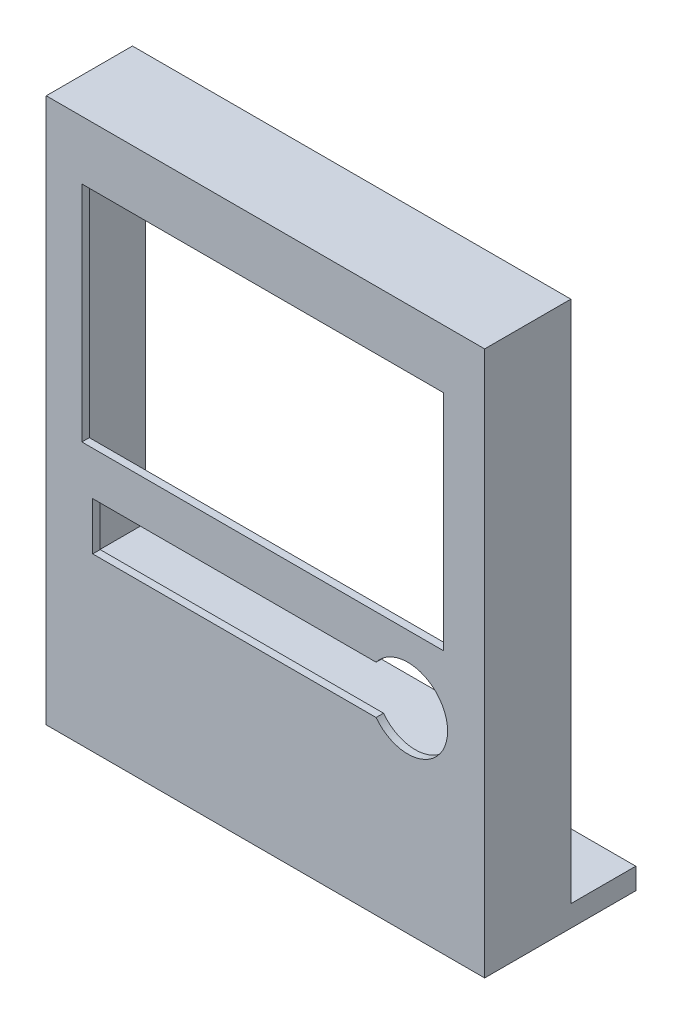
ISO-10303-21;
HEADER;
FILE_DESCRIPTION(('STEP AP214'),'2;1');
FILE_NAME('part.step','',(''),(''),'','','');
FILE_SCHEMA(('AUTOMOTIVE_DESIGN { 1 0 10303 214 1 1 1 1 }'));
ENDSEC;
DATA;
#1=APPLICATION_CONTEXT('core data for automotive mechanical design processes');
#2=APPLICATION_PROTOCOL_DEFINITION('international standard','automotive_design',2000,#1);
#3=PRODUCT_CONTEXT('',#1,'mechanical');
#4=PRODUCT('Part','Part','',(#3));
#5=PRODUCT_RELATED_PRODUCT_CATEGORY('part','',(#4));
#6=PRODUCT_DEFINITION_FORMATION('','',#4);
#7=PRODUCT_DEFINITION_CONTEXT('part definition',#1,'design');
#8=PRODUCT_DEFINITION('design','',#6,#7);
#9=PRODUCT_DEFINITION_SHAPE('','',#8);
#10=(LENGTH_UNIT() NAMED_UNIT(*) SI_UNIT(.MILLI.,.METRE.));
#11=(NAMED_UNIT(*) PLANE_ANGLE_UNIT() SI_UNIT($,.RADIAN.));
#12=(NAMED_UNIT(*) SI_UNIT($,.STERADIAN.) SOLID_ANGLE_UNIT());
#13=UNCERTAINTY_MEASURE_WITH_UNIT(LENGTH_MEASURE(1.E-05),#10,'distance_accuracy_value','');
#14=(GEOMETRIC_REPRESENTATION_CONTEXT(3) GLOBAL_UNCERTAINTY_ASSIGNED_CONTEXT((#13)) GLOBAL_UNIT_ASSIGNED_CONTEXT((#10,
#11,#12)) REPRESENTATION_CONTEXT('',''));
#15=CARTESIAN_POINT('',(0.,0.,0.));
#16=DIRECTION('',(0.,0.,1.));
#17=DIRECTION('',(1.,0.,0.));
#18=AXIS2_PLACEMENT_3D('',#15,#16,#17);
#19=CARTESIAN_POINT('',(-52.324,65.024,15.494));
#20=DIRECTION('',(0.,0.,1.));
#21=DIRECTION('',(0.,-1.,0.));
#22=AXIS2_PLACEMENT_3D('',#19,#20,#21);
#23=PLANE('',#22);
#24=DIRECTION('',(0.,-1.,0.));
#25=VECTOR('',#24,1.);
#26=CARTESIAN_POINT('',(52.324,65.024,15.494));
#27=LINE('',#26,#25);
#28=CARTESIAN_POINT('',(52.324,65.024,15.494));
#29=VERTEX_POINT('',#28);
#30=CARTESIAN_POINT('',(52.324,-59.944,15.494));
#31=VERTEX_POINT('',#30);
#32=EDGE_CURVE('E275',#29,#31,#27,.T.);
#33=ORIENTED_EDGE('',*,*,#32,.T.);
#34=DIRECTION('',(1.,0.,0.));
#35=VECTOR('',#34,1.);
#36=CARTESIAN_POINT('',(-52.324,-59.944,15.494));
#37=LINE('',#36,#35);
#38=CARTESIAN_POINT('',(-52.324,-59.944,15.494));
#39=VERTEX_POINT('',#38);
#40=EDGE_CURVE('E292',#39,#31,#37,.T.);
#41=ORIENTED_EDGE('',*,*,#40,.F.);
#42=DIRECTION('',(0.,-1.,0.));
#43=VECTOR('',#42,1.);
#44=CARTESIAN_POINT('',(-52.324,65.024,15.494));
#45=LINE('',#44,#43);
#46=CARTESIAN_POINT('',(-52.324,65.024,15.494));
#47=VERTEX_POINT('',#46);
#48=EDGE_CURVE('E274',#47,#39,#45,.T.);
#49=ORIENTED_EDGE('',*,*,#48,.F.);
#50=DIRECTION('',(1.,0.,0.));
#51=VECTOR('',#50,1.);
#52=CARTESIAN_POINT('',(-52.324,65.024,15.494));
#53=LINE('',#52,#51);
#54=EDGE_CURVE('E289',#47,#29,#53,.T.);
#55=ORIENTED_EDGE('',*,*,#54,.T.);
#56=EDGE_LOOP('',(#33,#41,#49,#55));
#57=FACE_BOUND('',#56,.T.);
#58=DIRECTION('',(0.,1.,0.));
#59=VECTOR('',#58,1.);
#60=CARTESIAN_POINT('',(49.149,0.,15.494));
#61=LINE('',#60,#59);
#62=CARTESIAN_POINT('',(49.149,-32.004,15.494));
#63=VERTEX_POINT('',#62);
#64=CARTESIAN_POINT('',(49.149,61.849,15.494));
#65=VERTEX_POINT('',#64);
#66=EDGE_CURVE('E218',#63,#65,#61,.T.);
#67=ORIENTED_EDGE('',*,*,#66,.T.);
#68=DIRECTION('',(1.,0.,0.));
#69=VECTOR('',#68,1.);
#70=CARTESIAN_POINT('',(0.,61.849,15.494));
#71=LINE('',#70,#69);
#72=CARTESIAN_POINT('',(-49.149,61.849,15.494));
#73=VERTEX_POINT('',#72);
#74=EDGE_CURVE('E232',#73,#65,#71,.T.);
#75=ORIENTED_EDGE('',*,*,#74,.F.);
#76=DIRECTION('',(0.,1.,0.));
#77=VECTOR('',#76,1.);
#78=CARTESIAN_POINT('',(-49.149,0.,15.494));
#79=LINE('',#78,#77);
#80=CARTESIAN_POINT('',(-49.149,-32.004,15.494));
#81=VERTEX_POINT('',#80);
#82=EDGE_CURVE('E251',#81,#73,#79,.T.);
#83=ORIENTED_EDGE('',*,*,#82,.F.);
#84=DIRECTION('',(1.,0.,0.));
#85=VECTOR('',#84,1.);
#86=CARTESIAN_POINT('',(0.,-32.004,15.494));
#87=LINE('',#86,#85);
#88=EDGE_CURVE('E247',#81,#63,#87,.T.);
#89=ORIENTED_EDGE('',*,*,#88,.T.);
#90=EDGE_LOOP('',(#67,#75,#83,#89));
#91=FACE_BOUND('',#90,.T.);
#92=ADVANCED_FACE('F39',(#57,#91),#23,.F.);
#93=CARTESIAN_POINT('',(52.324,-65.024,36.068));
#94=DIRECTION('',(-1.,0.,0.));
#95=DIRECTION('',(0.,0.,1.));
#96=AXIS2_PLACEMENT_3D('',#93,#94,#95);
#97=PLANE('',#96);
#98=DIRECTION('',(0.,0.,1.));
#99=VECTOR('',#98,1.);
#100=CARTESIAN_POINT('',(52.324,-59.944,0.));
#101=LINE('',#100,#99);
#102=CARTESIAN_POINT('',(52.324,-59.944,0.));
#103=VERTEX_POINT('',#102);
#104=EDGE_CURVE('E261',#103,#31,#101,.T.);
#105=ORIENTED_EDGE('',*,*,#104,.T.);
#106=ORIENTED_EDGE('',*,*,#32,.F.);
#107=DIRECTION('',(0.,0.,-1.));
#108=VECTOR('',#107,1.);
#109=CARTESIAN_POINT('',(52.324,65.024,36.068));
#110=LINE('',#109,#108);
#111=CARTESIAN_POINT('',(52.324,65.024,36.068));
#112=VERTEX_POINT('',#111);
#113=EDGE_CURVE('E330',#112,#29,#110,.T.);
#114=ORIENTED_EDGE('',*,*,#113,.F.);
#115=DIRECTION('',(0.,1.,0.));
#116=VECTOR('',#115,1.);
#117=CARTESIAN_POINT('',(52.324,-65.024,36.068));
#118=LINE('',#117,#116);
#119=CARTESIAN_POINT('',(52.324,-65.024,36.068));
#120=VERTEX_POINT('',#119);
#121=EDGE_CURVE('E296',#120,#112,#118,.T.);
#122=ORIENTED_EDGE('',*,*,#121,.F.);
#123=DIRECTION('',(0.,0.,-1.));
#124=VECTOR('',#123,1.);
#125=CARTESIAN_POINT('',(52.324,-65.024,36.068));
#126=LINE('',#125,#124);
#127=CARTESIAN_POINT('',(52.324,-65.024,0.));
#128=VERTEX_POINT('',#127);
#129=EDGE_CURVE('E310',#120,#128,#126,.T.);
#130=ORIENTED_EDGE('',*,*,#129,.T.);
#131=DIRECTION('',(0.,1.,0.));
#132=VECTOR('',#131,1.);
#133=CARTESIAN_POINT('',(52.324,-65.024,0.));
#134=LINE('',#133,#132);
#135=EDGE_CURVE('E295',#128,#103,#134,.T.);
#136=ORIENTED_EDGE('',*,*,#135,.T.);
#137=EDGE_LOOP('',(#105,#106,#114,#122,#130,#136));
#138=FACE_BOUND('',#137,.T.);
#139=ADVANCED_FACE('F41',(#138),#97,.F.);
#140=CARTESIAN_POINT('',(-52.324,-65.024,36.068));
#141=DIRECTION('',(1.,0.,0.));
#142=DIRECTION('',(0.,0.,-1.));
#143=AXIS2_PLACEMENT_3D('',#140,#141,#142);
#144=PLANE('',#143);
#145=DIRECTION('',(0.,0.,1.));
#146=VECTOR('',#145,1.);
#147=CARTESIAN_POINT('',(-52.324,-59.944,0.));
#148=LINE('',#147,#146);
#149=CARTESIAN_POINT('',(-52.324,-59.944,0.));
#150=VERTEX_POINT('',#149);
#151=EDGE_CURVE('E271',#150,#39,#148,.T.);
#152=ORIENTED_EDGE('',*,*,#151,.F.);
#153=DIRECTION('',(0.,-1.,0.));
#154=VECTOR('',#153,1.);
#155=CARTESIAN_POINT('',(-52.324,-65.024,0.));
#156=LINE('',#155,#154);
#157=CARTESIAN_POINT('',(-52.324,-65.024,0.));
#158=VERTEX_POINT('',#157);
#159=EDGE_CURVE('E314',#150,#158,#156,.T.);
#160=ORIENTED_EDGE('',*,*,#159,.T.);
#161=DIRECTION('',(0.,0.,-1.));
#162=VECTOR('',#161,1.);
#163=CARTESIAN_POINT('',(-52.324,-65.024,36.068));
#164=LINE('',#163,#162);
#165=CARTESIAN_POINT('',(-52.324,-65.024,36.068));
#166=VERTEX_POINT('',#165);
#167=EDGE_CURVE('E322',#166,#158,#164,.T.);
#168=ORIENTED_EDGE('',*,*,#167,.F.);
#169=DIRECTION('',(0.,-1.,0.));
#170=VECTOR('',#169,1.);
#171=CARTESIAN_POINT('',(-52.324,-65.024,36.068));
#172=LINE('',#171,#170);
#173=CARTESIAN_POINT('',(-52.324,65.024,36.068));
#174=VERTEX_POINT('',#173);
#175=EDGE_CURVE('E304',#174,#166,#172,.T.);
#176=ORIENTED_EDGE('',*,*,#175,.F.);
#177=DIRECTION('',(0.,0.,-1.));
#178=VECTOR('',#177,1.);
#179=CARTESIAN_POINT('',(-52.324,65.024,36.068));
#180=LINE('',#179,#178);
#181=EDGE_CURVE('E326',#174,#47,#180,.T.);
#182=ORIENTED_EDGE('',*,*,#181,.T.);
#183=ORIENTED_EDGE('',*,*,#48,.T.);
#184=EDGE_LOOP('',(#152,#160,#168,#176,#182,#183));
#185=FACE_BOUND('',#184,.T.);
#186=ADVANCED_FACE('F381',(#185),#144,.F.);
#187=CARTESIAN_POINT('',(0.,0.,0.));
#188=DIRECTION('',(0.,0.,-1.));
#189=DIRECTION('',(-1.,0.,0.));
#190=AXIS2_PLACEMENT_3D('',#187,#188,#189);
#191=PLANE('',#190);
#192=ORIENTED_EDGE('',*,*,#159,.F.);
#193=DIRECTION('',(1.,0.,0.));
#194=VECTOR('',#193,1.);
#195=CARTESIAN_POINT('',(-52.324,-59.944,0.));
#196=LINE('',#195,#194);
#197=EDGE_CURVE('E279',#150,#103,#196,.T.);
#198=ORIENTED_EDGE('',*,*,#197,.T.);
#199=ORIENTED_EDGE('',*,*,#135,.F.);
#200=DIRECTION('',(1.,0.,0.));
#201=VECTOR('',#200,1.);
#202=CARTESIAN_POINT('',(-52.324,-65.024,0.));
#203=LINE('',#202,#201);
#204=EDGE_CURVE('E301',#158,#128,#203,.T.);
#205=ORIENTED_EDGE('',*,*,#204,.F.);
#206=EDGE_LOOP('',(#192,#198,#199,#205));
#207=FACE_BOUND('',#206,.T.);
#208=ADVANCED_FACE('F395',(#207),#191,.T.);
#209=CARTESIAN_POINT('',(-52.324,65.024,36.068));
#210=DIRECTION('',(0.,-1.,0.));
#211=DIRECTION('',(0.,0.,-1.));
#212=AXIS2_PLACEMENT_3D('',#209,#210,#211);
#213=PLANE('',#212);
#214=ORIENTED_EDGE('',*,*,#113,.T.);
#215=ORIENTED_EDGE('',*,*,#54,.F.);
#216=ORIENTED_EDGE('',*,*,#181,.F.);
#217=DIRECTION('',(-1.,0.,0.));
#218=VECTOR('',#217,1.);
#219=CARTESIAN_POINT('',(-52.324,65.024,36.068));
#220=LINE('',#219,#218);
#221=EDGE_CURVE('E300',#112,#174,#220,.T.);
#222=ORIENTED_EDGE('',*,*,#221,.F.);
#223=EDGE_LOOP('',(#214,#215,#216,#222));
#224=FACE_BOUND('',#223,.T.);
#225=ADVANCED_FACE('F398',(#224),#213,.F.);
#226=CARTESIAN_POINT('',(-52.324,-65.024,36.068));
#227=DIRECTION('',(0.,1.,0.));
#228=DIRECTION('',(0.,0.,1.));
#229=AXIS2_PLACEMENT_3D('',#226,#227,#228);
#230=PLANE('',#229);
#231=ORIENTED_EDGE('',*,*,#204,.T.);
#232=ORIENTED_EDGE('',*,*,#129,.F.);
#233=DIRECTION('',(1.,0.,0.));
#234=VECTOR('',#233,1.);
#235=CARTESIAN_POINT('',(-52.324,-65.024,36.068));
#236=LINE('',#235,#234);
#237=EDGE_CURVE('E307',#166,#120,#236,.T.);
#238=ORIENTED_EDGE('',*,*,#237,.F.);
#239=ORIENTED_EDGE('',*,*,#167,.T.);
#240=EDGE_LOOP('',(#231,#232,#238,#239));
#241=FACE_BOUND('',#240,.T.);
#242=ADVANCED_FACE('F394',(#241),#230,.F.);
#243=CARTESIAN_POINT('',(0.,0.,36.068));
#244=DIRECTION('',(0.,0.,-1.));
#245=DIRECTION('',(-1.,0.,0.));
#246=AXIS2_PLACEMENT_3D('',#243,#244,#245);
#247=PLANE('',#246);
#248=DIRECTION('',(1.,0.,0.));
#249=VECTOR('',#248,1.);
#250=CARTESIAN_POINT('',(0.,-12.7,36.068));
#251=LINE('',#250,#249);
#252=CARTESIAN_POINT('',(-41.2298864382997,-12.7,36.068));
#253=VERTEX_POINT('',#252);
#254=CARTESIAN_POINT('',(26.4077851941256,-12.7,36.068));
#255=VERTEX_POINT('',#254);
#256=EDGE_CURVE('E177',#253,#255,#251,.T.);
#257=ORIENTED_EDGE('',*,*,#256,.T.);
#258=CARTESIAN_POINT('',(33.9844670642052,-18.415,36.068));
#259=DIRECTION('',(0.,0.,1.));
#260=DIRECTION('',(1.,0.,0.));
#261=AXIS2_PLACEMENT_3D('',#258,#259,#260);
#262=CIRCLE('',#261,9.49038108615207);
#263=CARTESIAN_POINT('',(26.4077851941256,-24.13,36.068));
#264=VERTEX_POINT('',#263);
#265=EDGE_CURVE('E55',#264,#255,#262,.T.);
#266=ORIENTED_EDGE('',*,*,#265,.F.);
#267=DIRECTION('',(1.,0.,0.));
#268=VECTOR('',#267,1.);
#269=CARTESIAN_POINT('',(0.,-24.13,36.068));
#270=LINE('',#269,#268);
#271=CARTESIAN_POINT('',(-41.2298864382997,-24.13,36.068));
#272=VERTEX_POINT('',#271);
#273=EDGE_CURVE('E185',#272,#264,#270,.T.);
#274=ORIENTED_EDGE('',*,*,#273,.F.);
#275=DIRECTION('',(0.,-1.,0.));
#276=VECTOR('',#275,1.);
#277=CARTESIAN_POINT('',(-41.2298864382997,0.,36.068));
#278=LINE('',#277,#276);
#279=EDGE_CURVE('E167',#253,#272,#278,.T.);
#280=ORIENTED_EDGE('',*,*,#279,.F.);
#281=EDGE_LOOP('',(#257,#266,#274,#280));
#282=FACE_BOUND('',#281,.T.);
#283=DIRECTION('',(-1.,0.,0.));
#284=VECTOR('',#283,1.);
#285=CARTESIAN_POINT('',(42.542463785238,51.054,36.068));
#286=LINE('',#285,#284);
#287=CARTESIAN_POINT('',(42.542463785238,51.054,36.068));
#288=VERTEX_POINT('',#287);
#289=CARTESIAN_POINT('',(-43.817536214762,51.054,36.068));
#290=VERTEX_POINT('',#289);
#291=EDGE_CURVE('E202',#288,#290,#286,.T.);
#292=ORIENTED_EDGE('',*,*,#291,.F.);
#293=DIRECTION('',(0.,1.,0.));
#294=VECTOR('',#293,1.);
#295=CARTESIAN_POINT('',(42.542463785238,51.054,36.068));
#296=LINE('',#295,#294);
#297=CARTESIAN_POINT('',(42.542463785238,-2.28600000000001,36.068));
#298=VERTEX_POINT('',#297);
#299=EDGE_CURVE('E195',#298,#288,#296,.T.);
#300=ORIENTED_EDGE('',*,*,#299,.F.);
#301=DIRECTION('',(1.,0.,0.));
#302=VECTOR('',#301,1.);
#303=CARTESIAN_POINT('',(42.542463785238,-2.28600000000001,36.068));
#304=LINE('',#303,#302);
#305=CARTESIAN_POINT('',(-43.817536214762,-2.28600000000002,36.068));
#306=VERTEX_POINT('',#305);
#307=EDGE_CURVE('E210',#306,#298,#304,.T.);
#308=ORIENTED_EDGE('',*,*,#307,.F.);
#309=DIRECTION('',(0.,-1.,0.));
#310=VECTOR('',#309,1.);
#311=CARTESIAN_POINT('',(-43.817536214762,51.054,36.068));
#312=LINE('',#311,#310);
#313=EDGE_CURVE('E206',#290,#306,#312,.T.);
#314=ORIENTED_EDGE('',*,*,#313,.F.);
#315=EDGE_LOOP('',(#292,#300,#308,#314));
#316=FACE_BOUND('',#315,.T.);
#317=ORIENTED_EDGE('',*,*,#121,.T.);
#318=ORIENTED_EDGE('',*,*,#221,.T.);
#319=ORIENTED_EDGE('',*,*,#175,.T.);
#320=ORIENTED_EDGE('',*,*,#237,.T.);
#321=EDGE_LOOP('',(#317,#318,#319,#320));
#322=FACE_BOUND('',#321,.T.);
#323=ADVANCED_FACE('F182',(#282,#316,#322),#247,.F.);
#324=CARTESIAN_POINT('',(-52.324,-59.944,0.));
#325=DIRECTION('',(0.,1.,0.));
#326=DIRECTION('',(0.,0.,1.));
#327=AXIS2_PLACEMENT_3D('',#324,#325,#326);
#328=PLANE('',#327);
#329=ORIENTED_EDGE('',*,*,#104,.F.);
#330=ORIENTED_EDGE('',*,*,#197,.F.);
#331=ORIENTED_EDGE('',*,*,#151,.T.);
#332=ORIENTED_EDGE('',*,*,#40,.T.);
#333=EDGE_LOOP('',(#329,#330,#331,#332));
#334=FACE_BOUND('',#333,.T.);
#335=ADVANCED_FACE('F388',(#334),#328,.T.);
#336=CARTESIAN_POINT('',(49.149,0.,34.29));
#337=DIRECTION('',(-1.,0.,0.));
#338=DIRECTION('',(0.,0.,1.));
#339=AXIS2_PLACEMENT_3D('',#336,#337,#338);
#340=PLANE('',#339);
#341=ORIENTED_EDGE('',*,*,#66,.F.);
#342=DIRECTION('',(0.,0.,-1.));
#343=VECTOR('',#342,1.);
#344=CARTESIAN_POINT('',(49.149,-32.004,34.29));
#345=LINE('',#344,#343);
#346=CARTESIAN_POINT('',(49.149,-32.004,34.29));
#347=VERTEX_POINT('',#346);
#348=EDGE_CURVE('E243',#347,#63,#345,.T.);
#349=ORIENTED_EDGE('',*,*,#348,.F.);
#350=DIRECTION('',(0.,1.,0.));
#351=VECTOR('',#350,1.);
#352=CARTESIAN_POINT('',(49.149,0.,34.29));
#353=LINE('',#352,#351);
#354=CARTESIAN_POINT('',(49.149,61.849,34.29));
#355=VERTEX_POINT('',#354);
#356=EDGE_CURVE('E228',#347,#355,#353,.T.);
#357=ORIENTED_EDGE('',*,*,#356,.T.);
#358=DIRECTION('',(0.,0.,-1.));
#359=VECTOR('',#358,1.);
#360=CARTESIAN_POINT('',(49.149,61.849,34.29));
#361=LINE('',#360,#359);
#362=EDGE_CURVE('E258',#355,#65,#361,.T.);
#363=ORIENTED_EDGE('',*,*,#362,.T.);
#364=EDGE_LOOP('',(#341,#349,#357,#363));
#365=FACE_BOUND('',#364,.T.);
#366=ADVANCED_FACE('F386',(#365),#340,.T.);
#367=CARTESIAN_POINT('',(0.,61.849,34.29));
#368=DIRECTION('',(0.,1.,0.));
#369=DIRECTION('',(-1.,0.,0.));
#370=AXIS2_PLACEMENT_3D('',#367,#368,#369);
#371=PLANE('',#370);
#372=ORIENTED_EDGE('',*,*,#74,.T.);
#373=ORIENTED_EDGE('',*,*,#362,.F.);
#374=DIRECTION('',(1.,0.,0.));
#375=VECTOR('',#374,1.);
#376=CARTESIAN_POINT('',(0.,61.849,34.29));
#377=LINE('',#376,#375);
#378=CARTESIAN_POINT('',(-49.149,61.849,34.29));
#379=VERTEX_POINT('',#378);
#380=EDGE_CURVE('E239',#379,#355,#377,.T.);
#381=ORIENTED_EDGE('',*,*,#380,.F.);
#382=DIRECTION('',(0.,0.,-1.));
#383=VECTOR('',#382,1.);
#384=CARTESIAN_POINT('',(-49.149,61.849,34.29));
#385=LINE('',#384,#383);
#386=EDGE_CURVE('E262',#379,#73,#385,.T.);
#387=ORIENTED_EDGE('',*,*,#386,.T.);
#388=EDGE_LOOP('',(#372,#373,#381,#387));
#389=FACE_BOUND('',#388,.T.);
#390=ADVANCED_FACE('F447',(#389),#371,.F.);
#391=CARTESIAN_POINT('',(-49.149,0.,34.29));
#392=DIRECTION('',(-1.,0.,0.));
#393=DIRECTION('',(0.,0.,1.));
#394=AXIS2_PLACEMENT_3D('',#391,#392,#393);
#395=PLANE('',#394);
#396=ORIENTED_EDGE('',*,*,#82,.T.);
#397=ORIENTED_EDGE('',*,*,#386,.F.);
#398=DIRECTION('',(0.,1.,0.));
#399=VECTOR('',#398,1.);
#400=CARTESIAN_POINT('',(-49.149,0.,34.29));
#401=LINE('',#400,#399);
#402=CARTESIAN_POINT('',(-49.149,-32.004,34.29));
#403=VERTEX_POINT('',#402);
#404=EDGE_CURVE('E235',#403,#379,#401,.T.);
#405=ORIENTED_EDGE('',*,*,#404,.F.);
#406=DIRECTION('',(0.,0.,-1.));
#407=VECTOR('',#406,1.);
#408=CARTESIAN_POINT('',(-49.149,-32.004,34.29));
#409=LINE('',#408,#407);
#410=EDGE_CURVE('E265',#403,#81,#409,.T.);
#411=ORIENTED_EDGE('',*,*,#410,.T.);
#412=EDGE_LOOP('',(#396,#397,#405,#411));
#413=FACE_BOUND('',#412,.T.);
#414=ADVANCED_FACE('F454',(#413),#395,.F.);
#415=CARTESIAN_POINT('',(0.,-32.004,34.29));
#416=DIRECTION('',(0.,1.,0.));
#417=DIRECTION('',(-1.,0.,0.));
#418=AXIS2_PLACEMENT_3D('',#415,#416,#417);
#419=PLANE('',#418);
#420=ORIENTED_EDGE('',*,*,#88,.F.);
#421=ORIENTED_EDGE('',*,*,#410,.F.);
#422=DIRECTION('',(1.,0.,0.));
#423=VECTOR('',#422,1.);
#424=CARTESIAN_POINT('',(0.,-32.004,34.29));
#425=LINE('',#424,#423);
#426=EDGE_CURVE('E231',#403,#347,#425,.T.);
#427=ORIENTED_EDGE('',*,*,#426,.T.);
#428=ORIENTED_EDGE('',*,*,#348,.T.);
#429=EDGE_LOOP('',(#420,#421,#427,#428));
#430=FACE_BOUND('',#429,.T.);
#431=ADVANCED_FACE('F462',(#430),#419,.T.);
#432=CARTESIAN_POINT('',(0.,0.,34.29));
#433=DIRECTION('',(0.,0.,-1.));
#434=DIRECTION('',(0.,1.,0.));
#435=AXIS2_PLACEMENT_3D('',#432,#433,#434);
#436=PLANE('',#435);
#437=CARTESIAN_POINT('',(33.9844670642052,-18.415,34.29));
#438=DIRECTION('',(0.,0.,-1.));
#439=DIRECTION('',(0.,1.,0.));
#440=AXIS2_PLACEMENT_3D('',#437,#438,#439);
#441=CIRCLE('',#440,9.49038108615207);
#442=CARTESIAN_POINT('',(26.4077851941256,-12.7,34.29));
#443=VERTEX_POINT('',#442);
#444=CARTESIAN_POINT('',(26.4077851941256,-24.13,34.29));
#445=VERTEX_POINT('',#444);
#446=EDGE_CURVE('E11',#443,#445,#441,.T.);
#447=ORIENTED_EDGE('',*,*,#446,.F.);
#448=DIRECTION('',(-1.,0.,0.));
#449=VECTOR('',#448,1.);
#450=CARTESIAN_POINT('',(0.,-12.7,34.29));
#451=LINE('',#450,#449);
#452=CARTESIAN_POINT('',(-41.2298864382997,-12.7,34.29));
#453=VERTEX_POINT('',#452);
#454=EDGE_CURVE('E347',#443,#453,#451,.T.);
#455=ORIENTED_EDGE('',*,*,#454,.T.);
#456=DIRECTION('',(0.,1.,0.));
#457=VECTOR('',#456,1.);
#458=CARTESIAN_POINT('',(-41.2298864382997,0.,34.29));
#459=LINE('',#458,#457);
#460=CARTESIAN_POINT('',(-41.2298864382997,-24.13,34.29));
#461=VERTEX_POINT('',#460);
#462=EDGE_CURVE('E170',#461,#453,#459,.T.);
#463=ORIENTED_EDGE('',*,*,#462,.F.);
#464=DIRECTION('',(-1.,0.,0.));
#465=VECTOR('',#464,1.);
#466=CARTESIAN_POINT('',(0.,-24.13,34.29));
#467=LINE('',#466,#465);
#468=EDGE_CURVE('E48',#445,#461,#467,.T.);
#469=ORIENTED_EDGE('',*,*,#468,.F.);
#470=EDGE_LOOP('',(#447,#455,#463,#469));
#471=FACE_BOUND('',#470,.T.);
#472=DIRECTION('',(0.,-1.,0.));
#473=VECTOR('',#472,1.);
#474=CARTESIAN_POINT('',(42.542463785238,0.,34.29));
#475=LINE('',#474,#473);
#476=CARTESIAN_POINT('',(42.542463785238,51.054,34.29));
#477=VERTEX_POINT('',#476);
#478=CARTESIAN_POINT('',(42.542463785238,-2.28600000000001,34.29));
#479=VERTEX_POINT('',#478);
#480=EDGE_CURVE('E344',#477,#479,#475,.T.);
#481=ORIENTED_EDGE('',*,*,#480,.F.);
#482=DIRECTION('',(1.,0.,0.));
#483=VECTOR('',#482,1.);
#484=CARTESIAN_POINT('',(0.,51.054,34.29));
#485=LINE('',#484,#483);
#486=CARTESIAN_POINT('',(-43.817536214762,51.054,34.29));
#487=VERTEX_POINT('',#486);
#488=EDGE_CURVE('E334',#487,#477,#485,.T.);
#489=ORIENTED_EDGE('',*,*,#488,.F.);
#490=DIRECTION('',(0.,1.,0.));
#491=VECTOR('',#490,1.);
#492=CARTESIAN_POINT('',(-43.817536214762,0.,34.29));
#493=LINE('',#492,#491);
#494=CARTESIAN_POINT('',(-43.817536214762,-2.28600000000002,34.29));
#495=VERTEX_POINT('',#494);
#496=EDGE_CURVE('E337',#495,#487,#493,.T.);
#497=ORIENTED_EDGE('',*,*,#496,.F.);
#498=DIRECTION('',(-1.,0.,0.));
#499=VECTOR('',#498,1.);
#500=CARTESIAN_POINT('',(0.,-2.28600000000001,34.29));
#501=LINE('',#500,#499);
#502=EDGE_CURVE('E341',#479,#495,#501,.T.);
#503=ORIENTED_EDGE('',*,*,#502,.F.);
#504=EDGE_LOOP('',(#481,#489,#497,#503));
#505=FACE_BOUND('',#504,.T.);
#506=ORIENTED_EDGE('',*,*,#356,.F.);
#507=ORIENTED_EDGE('',*,*,#426,.F.);
#508=ORIENTED_EDGE('',*,*,#404,.T.);
#509=ORIENTED_EDGE('',*,*,#380,.T.);
#510=EDGE_LOOP('',(#506,#507,#508,#509));
#511=FACE_BOUND('',#510,.T.);
#512=ADVANCED_FACE('F358',(#471,#505,#511),#436,.T.);
#513=CARTESIAN_POINT('',(42.542463785238,51.054,17.272));
#514=DIRECTION('',(1.,0.,0.));
#515=DIRECTION('',(0.,1.,0.));
#516=AXIS2_PLACEMENT_3D('',#513,#514,#515);
#517=PLANE('',#516);
#518=ORIENTED_EDGE('',*,*,#480,.T.);
#519=DIRECTION('',(0.,0.,1.));
#520=VECTOR('',#519,1.);
#521=CARTESIAN_POINT('',(42.542463785238,-2.28600000000001,17.272));
#522=LINE('',#521,#520);
#523=EDGE_CURVE('E215',#479,#298,#522,.T.);
#524=ORIENTED_EDGE('',*,*,#523,.T.);
#525=ORIENTED_EDGE('',*,*,#299,.T.);
#526=DIRECTION('',(0.,0.,1.));
#527=VECTOR('',#526,1.);
#528=CARTESIAN_POINT('',(42.542463785238,51.054,17.272));
#529=LINE('',#528,#527);
#530=EDGE_CURVE('E214',#477,#288,#529,.T.);
#531=ORIENTED_EDGE('',*,*,#530,.F.);
#532=EDGE_LOOP('',(#518,#524,#525,#531));
#533=FACE_BOUND('',#532,.T.);
#534=ADVANCED_FACE('F476',(#533),#517,.F.);
#535=CARTESIAN_POINT('',(42.542463785238,-2.28600000000001,17.272));
#536=DIRECTION('',(0.,-1.,0.));
#537=DIRECTION('',(1.,0.,0.));
#538=AXIS2_PLACEMENT_3D('',#535,#536,#537);
#539=PLANE('',#538);
#540=ORIENTED_EDGE('',*,*,#502,.T.);
#541=DIRECTION('',(0.,0.,1.));
#542=VECTOR('',#541,1.);
#543=CARTESIAN_POINT('',(-43.817536214762,-2.28600000000002,17.272));
#544=LINE('',#543,#542);
#545=EDGE_CURVE('E219',#495,#306,#544,.T.);
#546=ORIENTED_EDGE('',*,*,#545,.T.);
#547=ORIENTED_EDGE('',*,*,#307,.T.);
#548=ORIENTED_EDGE('',*,*,#523,.F.);
#549=EDGE_LOOP('',(#540,#546,#547,#548));
#550=FACE_BOUND('',#549,.T.);
#551=ADVANCED_FACE('F482',(#550),#539,.F.);
#552=CARTESIAN_POINT('',(-43.817536214762,51.054,17.272));
#553=DIRECTION('',(-1.,0.,0.));
#554=DIRECTION('',(0.,0.,1.));
#555=AXIS2_PLACEMENT_3D('',#552,#553,#554);
#556=PLANE('',#555);
#557=ORIENTED_EDGE('',*,*,#496,.T.);
#558=DIRECTION('',(0.,0.,1.));
#559=VECTOR('',#558,1.);
#560=CARTESIAN_POINT('',(-43.817536214762,51.054,17.272));
#561=LINE('',#560,#559);
#562=EDGE_CURVE('E222',#487,#290,#561,.T.);
#563=ORIENTED_EDGE('',*,*,#562,.T.);
#564=ORIENTED_EDGE('',*,*,#313,.T.);
#565=ORIENTED_EDGE('',*,*,#545,.F.);
#566=EDGE_LOOP('',(#557,#563,#564,#565));
#567=FACE_BOUND('',#566,.T.);
#568=ADVANCED_FACE('F370',(#567),#556,.F.);
#569=CARTESIAN_POINT('',(42.542463785238,51.054,17.272));
#570=DIRECTION('',(0.,1.,0.));
#571=DIRECTION('',(-1.,0.,0.));
#572=AXIS2_PLACEMENT_3D('',#569,#570,#571);
#573=PLANE('',#572);
#574=ORIENTED_EDGE('',*,*,#488,.T.);
#575=ORIENTED_EDGE('',*,*,#530,.T.);
#576=ORIENTED_EDGE('',*,*,#291,.T.);
#577=ORIENTED_EDGE('',*,*,#562,.F.);
#578=EDGE_LOOP('',(#574,#575,#576,#577));
#579=FACE_BOUND('',#578,.T.);
#580=ADVANCED_FACE('F363',(#579),#573,.F.);
#581=CARTESIAN_POINT('',(33.9844670642052,-18.415,17.272));
#582=DIRECTION('',(0.,0.,1.));
#583=DIRECTION('',(1.,0.,0.));
#584=AXIS2_PLACEMENT_3D('',#581,#582,#583);
#585=CYLINDRICAL_SURFACE('',#584,9.49038108615207);
#586=ORIENTED_EDGE('',*,*,#446,.T.);
#587=DIRECTION('',(0.,0.,1.));
#588=VECTOR('',#587,1.);
#589=CARTESIAN_POINT('',(26.4077851941256,-24.13,17.272));
#590=LINE('',#589,#588);
#591=EDGE_CURVE('E192',#445,#264,#590,.T.);
#592=ORIENTED_EDGE('',*,*,#591,.T.);
#593=ORIENTED_EDGE('',*,*,#265,.T.);
#594=DIRECTION('',(0.,0.,1.));
#595=VECTOR('',#594,1.);
#596=CARTESIAN_POINT('',(26.4077851941256,-12.7,17.272));
#597=LINE('',#596,#595);
#598=EDGE_CURVE('E174',#443,#255,#597,.T.);
#599=ORIENTED_EDGE('',*,*,#598,.F.);
#600=EDGE_LOOP('',(#586,#592,#593,#599));
#601=FACE_BOUND('',#600,.T.);
#602=ADVANCED_FACE('F360',(#601),#585,.F.);
#603=CARTESIAN_POINT('',(0.,-24.13,17.272));
#604=DIRECTION('',(0.,-1.,0.));
#605=DIRECTION('',(0.,0.,-1.));
#606=AXIS2_PLACEMENT_3D('',#603,#604,#605);
#607=PLANE('',#606);
#608=ORIENTED_EDGE('',*,*,#468,.T.);
#609=DIRECTION('',(0.,0.,1.));
#610=VECTOR('',#609,1.);
#611=CARTESIAN_POINT('',(-41.2298864382997,-24.13,17.272));
#612=LINE('',#611,#610);
#613=EDGE_CURVE('E173',#461,#272,#612,.T.);
#614=ORIENTED_EDGE('',*,*,#613,.T.);
#615=ORIENTED_EDGE('',*,*,#273,.T.);
#616=ORIENTED_EDGE('',*,*,#591,.F.);
#617=EDGE_LOOP('',(#608,#614,#615,#616));
#618=FACE_BOUND('',#617,.T.);
#619=ADVANCED_FACE('F355',(#618),#607,.F.);
#620=CARTESIAN_POINT('',(-41.2298864382997,0.,17.272));
#621=DIRECTION('',(-1.,0.,0.));
#622=DIRECTION('',(0.,0.,1.));
#623=AXIS2_PLACEMENT_3D('',#620,#621,#622);
#624=PLANE('',#623);
#625=ORIENTED_EDGE('',*,*,#462,.T.);
#626=DIRECTION('',(0.,0.,1.));
#627=VECTOR('',#626,1.);
#628=CARTESIAN_POINT('',(-41.2298864382997,-12.7,17.272));
#629=LINE('',#628,#627);
#630=EDGE_CURVE('E63',#453,#253,#629,.T.);
#631=ORIENTED_EDGE('',*,*,#630,.T.);
#632=ORIENTED_EDGE('',*,*,#279,.T.);
#633=ORIENTED_EDGE('',*,*,#613,.F.);
#634=EDGE_LOOP('',(#625,#631,#632,#633));
#635=FACE_BOUND('',#634,.T.);
#636=ADVANCED_FACE('F164',(#635),#624,.F.);
#637=CARTESIAN_POINT('',(0.,-12.7,17.272));
#638=DIRECTION('',(0.,-1.,0.));
#639=DIRECTION('',(0.,0.,-1.));
#640=AXIS2_PLACEMENT_3D('',#637,#638,#639);
#641=PLANE('',#640);
#642=ORIENTED_EDGE('',*,*,#598,.T.);
#643=ORIENTED_EDGE('',*,*,#256,.F.);
#644=ORIENTED_EDGE('',*,*,#630,.F.);
#645=ORIENTED_EDGE('',*,*,#454,.F.);
#646=EDGE_LOOP('',(#642,#643,#644,#645));
#647=FACE_BOUND('',#646,.T.);
#648=ADVANCED_FACE('F178',(#647),#641,.T.);
#649=CLOSED_SHELL('',(#92,#139,#186,#208,#225,#242,#323,#335,#366,#390,#414,#431,#512,#534,#551,
#568,#580,#602,#619,#636,#648));
#650=MANIFOLD_SOLID_BREP('B2',#649);
#651=ADVANCED_BREP_SHAPE_REPRESENTATION('',(#18,#650),#14);
#652=SHAPE_DEFINITION_REPRESENTATION(#9,#651);
ENDSEC;
END-ISO-10303-21;
